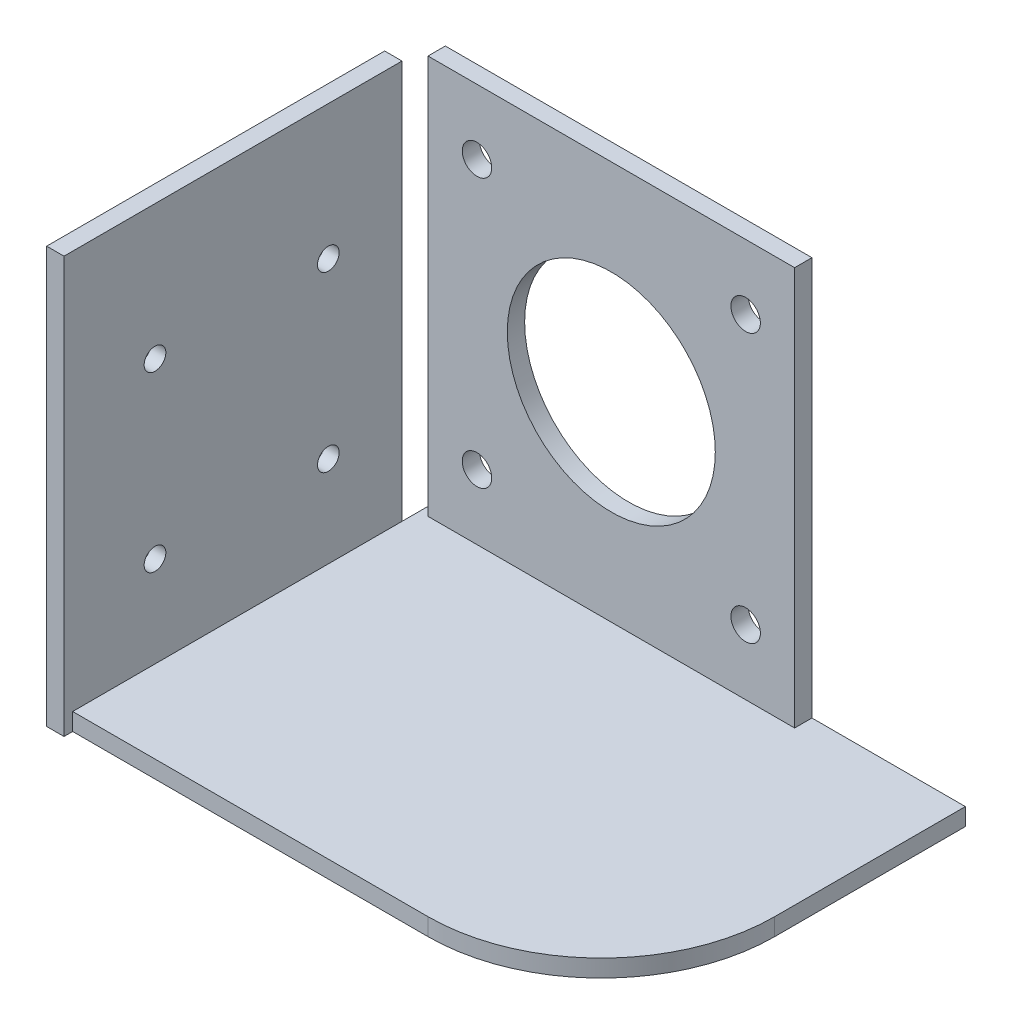
ISO-10303-21;
HEADER;
FILE_DESCRIPTION(('STEP AP214'),'2;1');
FILE_NAME('part.step','',(''),(''),'','','');
FILE_SCHEMA(('AUTOMOTIVE_DESIGN { 1 0 10303 214 1 1 1 1 }'));
ENDSEC;
DATA;
#1=APPLICATION_CONTEXT('core data for automotive mechanical design processes');
#2=APPLICATION_PROTOCOL_DEFINITION('international standard','automotive_design',2000,#1);
#3=PRODUCT_CONTEXT('',#1,'mechanical');
#4=PRODUCT('Part','Part','',(#3));
#5=PRODUCT_RELATED_PRODUCT_CATEGORY('part','',(#4));
#6=PRODUCT_DEFINITION_FORMATION('','',#4);
#7=PRODUCT_DEFINITION_CONTEXT('part definition',#1,'design');
#8=PRODUCT_DEFINITION('design','',#6,#7);
#9=PRODUCT_DEFINITION_SHAPE('','',#8);
#10=(LENGTH_UNIT() NAMED_UNIT(*) SI_UNIT(.MILLI.,.METRE.));
#11=(NAMED_UNIT(*) PLANE_ANGLE_UNIT() SI_UNIT($,.RADIAN.));
#12=(NAMED_UNIT(*) SI_UNIT($,.STERADIAN.) SOLID_ANGLE_UNIT());
#13=UNCERTAINTY_MEASURE_WITH_UNIT(LENGTH_MEASURE(1.E-05),#10,'distance_accuracy_value','');
#14=(GEOMETRIC_REPRESENTATION_CONTEXT(3) GLOBAL_UNCERTAINTY_ASSIGNED_CONTEXT((#13)) GLOBAL_UNIT_ASSIGNED_CONTEXT((#10,
#11,#12)) REPRESENTATION_CONTEXT('',''));
#15=CARTESIAN_POINT('',(0.,0.,0.));
#16=DIRECTION('',(0.,0.,1.));
#17=DIRECTION('',(1.,0.,0.));
#18=AXIS2_PLACEMENT_3D('',#15,#16,#17);
#19=CARTESIAN_POINT('',(0.,0.,2.));
#20=DIRECTION('',(0.,0.,-1.));
#21=DIRECTION('',(-1.,0.,0.));
#22=AXIS2_PLACEMENT_3D('',#19,#20,#21);
#23=PLANE('',#22);
#24=DIRECTION('',(0.,1.,0.));
#25=VECTOR('',#24,1.);
#26=CARTESIAN_POINT('',(21.15,-23.,2.));
#27=LINE('',#26,#25);
#28=CARTESIAN_POINT('',(21.15,-23.,2.));
#29=VERTEX_POINT('',#28);
#30=CARTESIAN_POINT('',(21.15,23.,2.));
#31=VERTEX_POINT('',#30);
#32=EDGE_CURVE('E249',#29,#31,#27,.T.);
#33=ORIENTED_EDGE('',*,*,#32,.T.);
#34=DIRECTION('',(-1.,0.,0.));
#35=VECTOR('',#34,1.);
#36=CARTESIAN_POINT('',(-21.15,23.,2.));
#37=LINE('',#36,#35);
#38=CARTESIAN_POINT('',(-21.15,23.,2.));
#39=VERTEX_POINT('',#38);
#40=EDGE_CURVE('E83',#31,#39,#37,.T.);
#41=ORIENTED_EDGE('',*,*,#40,.T.);
#42=DIRECTION('',(0.,-1.,0.));
#43=VECTOR('',#42,1.);
#44=CARTESIAN_POINT('',(-21.15,-23.,2.));
#45=LINE('',#44,#43);
#46=CARTESIAN_POINT('',(-21.15,-23.,2.));
#47=VERTEX_POINT('',#46);
#48=EDGE_CURVE('E253',#39,#47,#45,.T.);
#49=ORIENTED_EDGE('',*,*,#48,.T.);
#50=DIRECTION('',(1.,0.,0.));
#51=VECTOR('',#50,1.);
#52=CARTESIAN_POINT('',(-21.15,-23.,2.));
#53=LINE('',#52,#51);
#54=EDGE_CURVE('E58',#47,#29,#53,.T.);
#55=ORIENTED_EDGE('',*,*,#54,.T.);
#56=EDGE_LOOP('',(#33,#41,#49,#55));
#57=FACE_BOUND('',#56,.T.);
#58=CARTESIAN_POINT('',(0.,0.,2.));
#59=DIRECTION('',(0.,0.,1.));
#60=DIRECTION('',(1.,0.,0.));
#61=AXIS2_PLACEMENT_3D('',#58,#59,#60);
#62=CIRCLE('',#61,12.);
#63=CARTESIAN_POINT('',(12.,0.,2.));
#64=VERTEX_POINT('',#63);
#65=EDGE_CURVE('E243',#64,#64,#62,.T.);
#66=ORIENTED_EDGE('',*,*,#65,.F.);
#67=EDGE_LOOP('',(#66));
#68=FACE_BOUND('',#67,.T.);
#69=CARTESIAN_POINT('',(-15.5,15.5,2.));
#70=DIRECTION('',(0.,0.,1.));
#71=DIRECTION('',(1.,0.,0.));
#72=AXIS2_PLACEMENT_3D('',#69,#70,#71);
#73=CIRCLE('',#72,1.7);
#74=CARTESIAN_POINT('',(-13.8,15.5,2.));
#75=VERTEX_POINT('',#74);
#76=EDGE_CURVE('E237',#75,#75,#73,.T.);
#77=ORIENTED_EDGE('',*,*,#76,.F.);
#78=EDGE_LOOP('',(#77));
#79=FACE_BOUND('',#78,.T.);
#80=CARTESIAN_POINT('',(15.5,15.5000000000009,2.));
#81=DIRECTION('',(0.,0.,1.));
#82=DIRECTION('',(1.,0.,0.));
#83=AXIS2_PLACEMENT_3D('',#80,#81,#82);
#84=CIRCLE('',#83,1.7000000000009);
#85=CARTESIAN_POINT('',(17.2000000000009,15.5000000000009,2.));
#86=VERTEX_POINT('',#85);
#87=EDGE_CURVE('E231',#86,#86,#84,.T.);
#88=ORIENTED_EDGE('',*,*,#87,.F.);
#89=EDGE_LOOP('',(#88));
#90=FACE_BOUND('',#89,.T.);
#91=CARTESIAN_POINT('',(15.5000000000009,-15.4999999999991,2.));
#92=DIRECTION('',(0.,0.,1.));
#93=DIRECTION('',(1.,0.,0.));
#94=AXIS2_PLACEMENT_3D('',#91,#92,#93);
#95=CIRCLE('',#94,1.70000000000123);
#96=CARTESIAN_POINT('',(17.2000000000021,-15.4999999999991,2.));
#97=VERTEX_POINT('',#96);
#98=EDGE_CURVE('E225',#97,#97,#95,.T.);
#99=ORIENTED_EDGE('',*,*,#98,.F.);
#100=EDGE_LOOP('',(#99));
#101=FACE_BOUND('',#100,.T.);
#102=CARTESIAN_POINT('',(-15.4999999999991,-15.5,2.));
#103=DIRECTION('',(0.,0.,1.));
#104=DIRECTION('',(1.,0.,0.));
#105=AXIS2_PLACEMENT_3D('',#102,#103,#104);
#106=CIRCLE('',#105,1.70000000000047);
#107=CARTESIAN_POINT('',(-13.7999999999987,-15.5,2.));
#108=VERTEX_POINT('',#107);
#109=EDGE_CURVE('E219',#108,#108,#106,.T.);
#110=ORIENTED_EDGE('',*,*,#109,.F.);
#111=EDGE_LOOP('',(#110));
#112=FACE_BOUND('',#111,.T.);
#113=ADVANCED_FACE('F34',(#57,#68,#79,#90,#101,#112),#23,.F.);
#114=CARTESIAN_POINT('',(0.,0.,0.));
#115=DIRECTION('',(0.,0.,-1.));
#116=DIRECTION('',(-1.,0.,0.));
#117=AXIS2_PLACEMENT_3D('',#114,#115,#116);
#118=PLANE('',#117);
#119=CARTESIAN_POINT('',(15.5000000000009,-15.4999999999991,0.));
#120=DIRECTION('',(0.,0.,1.));
#121=DIRECTION('',(1.,0.,0.));
#122=AXIS2_PLACEMENT_3D('',#119,#120,#121);
#123=CIRCLE('',#122,1.70000000000123);
#124=CARTESIAN_POINT('',(17.2000000000021,-15.4999999999991,0.));
#125=VERTEX_POINT('',#124);
#126=EDGE_CURVE('E222',#125,#125,#123,.T.);
#127=ORIENTED_EDGE('',*,*,#126,.T.);
#128=EDGE_LOOP('',(#127));
#129=FACE_BOUND('',#128,.T.);
#130=CARTESIAN_POINT('',(-15.5,15.5,0.));
#131=DIRECTION('',(0.,0.,1.));
#132=DIRECTION('',(1.,0.,0.));
#133=AXIS2_PLACEMENT_3D('',#130,#131,#132);
#134=CIRCLE('',#133,1.7);
#135=CARTESIAN_POINT('',(-13.8,15.5,0.));
#136=VERTEX_POINT('',#135);
#137=EDGE_CURVE('E234',#136,#136,#134,.T.);
#138=ORIENTED_EDGE('',*,*,#137,.T.);
#139=EDGE_LOOP('',(#138));
#140=FACE_BOUND('',#139,.T.);
#141=DIRECTION('',(0.,1.,0.));
#142=VECTOR('',#141,1.);
#143=CARTESIAN_POINT('',(21.15,-23.,0.));
#144=LINE('',#143,#142);
#145=CARTESIAN_POINT('',(21.15,-23.,0.));
#146=VERTEX_POINT('',#145);
#147=CARTESIAN_POINT('',(21.15,23.,0.));
#148=VERTEX_POINT('',#147);
#149=EDGE_CURVE('E246',#146,#148,#144,.T.);
#150=ORIENTED_EDGE('',*,*,#149,.F.);
#151=DIRECTION('',(1.,0.,0.));
#152=VECTOR('',#151,1.);
#153=CARTESIAN_POINT('',(-21.15,-23.,0.));
#154=LINE('',#153,#152);
#155=CARTESIAN_POINT('',(38.85,-23.,0.));
#156=VERTEX_POINT('',#155);
#157=EDGE_CURVE('E178',#146,#156,#154,.T.);
#158=ORIENTED_EDGE('',*,*,#157,.T.);
#159=DIRECTION('',(0.,1.,0.));
#160=VECTOR('',#159,1.);
#161=CARTESIAN_POINT('',(38.85,-25.,0.));
#162=LINE('',#161,#160);
#163=CARTESIAN_POINT('',(38.85,-25.,0.));
#164=VERTEX_POINT('',#163);
#165=EDGE_CURVE('E215',#164,#156,#162,.T.);
#166=ORIENTED_EDGE('',*,*,#165,.F.);
#167=DIRECTION('',(1.,0.,0.));
#168=VECTOR('',#167,1.);
#169=CARTESIAN_POINT('',(-21.15,-25.,0.));
#170=LINE('',#169,#168);
#171=CARTESIAN_POINT('',(-22.15,-25.,0.));
#172=VERTEX_POINT('',#171);
#173=EDGE_CURVE('E179',#172,#164,#170,.T.);
#174=ORIENTED_EDGE('',*,*,#173,.F.);
#175=DIRECTION('',(0.,1.,0.));
#176=VECTOR('',#175,1.);
#177=CARTESIAN_POINT('',(-22.15,-25.,0.));
#178=LINE('',#177,#176);
#179=CARTESIAN_POINT('',(-22.15,-23.,0.));
#180=VERTEX_POINT('',#179);
#181=EDGE_CURVE('E191',#172,#180,#178,.T.);
#182=ORIENTED_EDGE('',*,*,#181,.T.);
#183=CARTESIAN_POINT('',(-21.15,-23.,0.));
#184=VERTEX_POINT('',#183);
#185=EDGE_CURVE('E192',#180,#184,#154,.T.);
#186=ORIENTED_EDGE('',*,*,#185,.T.);
#187=DIRECTION('',(0.,-1.,0.));
#188=VECTOR('',#187,1.);
#189=CARTESIAN_POINT('',(-21.15,-23.,0.));
#190=LINE('',#189,#188);
#191=CARTESIAN_POINT('',(-21.15,23.,0.));
#192=VERTEX_POINT('',#191);
#193=EDGE_CURVE('E251',#192,#184,#190,.T.);
#194=ORIENTED_EDGE('',*,*,#193,.F.);
#195=DIRECTION('',(-1.,0.,0.));
#196=VECTOR('',#195,1.);
#197=CARTESIAN_POINT('',(-21.15,23.,0.));
#198=LINE('',#197,#196);
#199=EDGE_CURVE('E257',#148,#192,#198,.T.);
#200=ORIENTED_EDGE('',*,*,#199,.F.);
#201=EDGE_LOOP('',(#150,#158,#166,#174,#182,#186,#194,#200));
#202=FACE_BOUND('',#201,.T.);
#203=CARTESIAN_POINT('',(0.,0.,0.));
#204=DIRECTION('',(0.,0.,1.));
#205=DIRECTION('',(1.,0.,0.));
#206=AXIS2_PLACEMENT_3D('',#203,#204,#205);
#207=CIRCLE('',#206,12.);
#208=CARTESIAN_POINT('',(12.,0.,0.));
#209=VERTEX_POINT('',#208);
#210=EDGE_CURVE('E240',#209,#209,#207,.T.);
#211=ORIENTED_EDGE('',*,*,#210,.T.);
#212=EDGE_LOOP('',(#211));
#213=FACE_BOUND('',#212,.T.);
#214=CARTESIAN_POINT('',(15.5,15.5000000000009,0.));
#215=DIRECTION('',(0.,0.,1.));
#216=DIRECTION('',(1.,0.,0.));
#217=AXIS2_PLACEMENT_3D('',#214,#215,#216);
#218=CIRCLE('',#217,1.7000000000009);
#219=CARTESIAN_POINT('',(17.2000000000009,15.5000000000009,0.));
#220=VERTEX_POINT('',#219);
#221=EDGE_CURVE('E228',#220,#220,#218,.T.);
#222=ORIENTED_EDGE('',*,*,#221,.T.);
#223=EDGE_LOOP('',(#222));
#224=FACE_BOUND('',#223,.T.);
#225=CARTESIAN_POINT('',(-15.4999999999991,-15.5,0.));
#226=DIRECTION('',(0.,0.,1.));
#227=DIRECTION('',(1.,0.,0.));
#228=AXIS2_PLACEMENT_3D('',#225,#226,#227);
#229=CIRCLE('',#228,1.70000000000047);
#230=CARTESIAN_POINT('',(-13.7999999999987,-15.5,0.));
#231=VERTEX_POINT('',#230);
#232=EDGE_CURVE('E218',#231,#231,#229,.T.);
#233=ORIENTED_EDGE('',*,*,#232,.T.);
#234=EDGE_LOOP('',(#233));
#235=FACE_BOUND('',#234,.T.);
#236=ADVANCED_FACE('F270',(#129,#140,#202,#213,#224,#235),#118,.T.);
#237=CARTESIAN_POINT('',(21.15,-23.,2.));
#238=DIRECTION('',(-1.,0.,0.));
#239=DIRECTION('',(0.,0.,1.));
#240=AXIS2_PLACEMENT_3D('',#237,#238,#239);
#241=PLANE('',#240);
#242=ORIENTED_EDGE('',*,*,#149,.T.);
#243=DIRECTION('',(0.,0.,-1.));
#244=VECTOR('',#243,1.);
#245=CARTESIAN_POINT('',(21.15,23.,2.));
#246=LINE('',#245,#244);
#247=EDGE_CURVE('E11',#31,#148,#246,.T.);
#248=ORIENTED_EDGE('',*,*,#247,.F.);
#249=ORIENTED_EDGE('',*,*,#32,.F.);
#250=DIRECTION('',(0.,0.,-1.));
#251=VECTOR('',#250,1.);
#252=CARTESIAN_POINT('',(21.15,-23.,2.));
#253=LINE('',#252,#251);
#254=EDGE_CURVE('E76',#29,#146,#253,.T.);
#255=ORIENTED_EDGE('',*,*,#254,.T.);
#256=EDGE_LOOP('',(#242,#248,#249,#255));
#257=FACE_BOUND('',#256,.T.);
#258=ADVANCED_FACE('F36',(#257),#241,.F.);
#259=CARTESIAN_POINT('',(-21.15,23.,2.));
#260=DIRECTION('',(0.,-1.,0.));
#261=DIRECTION('',(0.,0.,-1.));
#262=AXIS2_PLACEMENT_3D('',#259,#260,#261);
#263=PLANE('',#262);
#264=ORIENTED_EDGE('',*,*,#199,.T.);
#265=DIRECTION('',(0.,0.,-1.));
#266=VECTOR('',#265,1.);
#267=CARTESIAN_POINT('',(-21.15,23.,2.));
#268=LINE('',#267,#266);
#269=EDGE_CURVE('E42',#39,#192,#268,.T.);
#270=ORIENTED_EDGE('',*,*,#269,.F.);
#271=ORIENTED_EDGE('',*,*,#40,.F.);
#272=ORIENTED_EDGE('',*,*,#247,.T.);
#273=EDGE_LOOP('',(#264,#270,#271,#272));
#274=FACE_BOUND('',#273,.T.);
#275=ADVANCED_FACE('F316',(#274),#263,.F.);
#276=CARTESIAN_POINT('',(-21.15,-23.,2.));
#277=DIRECTION('',(1.,0.,0.));
#278=DIRECTION('',(0.,0.,-1.));
#279=AXIS2_PLACEMENT_3D('',#276,#277,#278);
#280=PLANE('',#279);
#281=ORIENTED_EDGE('',*,*,#193,.T.);
#282=DIRECTION('',(0.,0.,-1.));
#283=VECTOR('',#282,1.);
#284=CARTESIAN_POINT('',(-21.15,-23.,2.));
#285=LINE('',#284,#283);
#286=EDGE_CURVE('E261',#47,#184,#285,.T.);
#287=ORIENTED_EDGE('',*,*,#286,.F.);
#288=ORIENTED_EDGE('',*,*,#48,.F.);
#289=ORIENTED_EDGE('',*,*,#269,.T.);
#290=EDGE_LOOP('',(#281,#287,#288,#289));
#291=FACE_BOUND('',#290,.T.);
#292=ADVANCED_FACE('F267',(#291),#280,.F.);
#293=CARTESIAN_POINT('',(0.,0.,2.));
#294=DIRECTION('',(0.,0.,-1.));
#295=DIRECTION('',(-1.,0.,0.));
#296=AXIS2_PLACEMENT_3D('',#293,#294,#295);
#297=CYLINDRICAL_SURFACE('',#296,12.);
#298=ORIENTED_EDGE('',*,*,#65,.T.);
#299=EDGE_LOOP('',(#298));
#300=FACE_BOUND('',#299,.T.);
#301=ORIENTED_EDGE('',*,*,#210,.F.);
#302=EDGE_LOOP('',(#301));
#303=FACE_BOUND('',#302,.T.);
#304=ADVANCED_FACE('F312',(#300,#303),#297,.F.);
#305=CARTESIAN_POINT('',(-15.5,15.5,2.));
#306=DIRECTION('',(0.,0.,-1.));
#307=DIRECTION('',(-1.,0.,0.));
#308=AXIS2_PLACEMENT_3D('',#305,#306,#307);
#309=CYLINDRICAL_SURFACE('',#308,1.7);
#310=ORIENTED_EDGE('',*,*,#76,.T.);
#311=EDGE_LOOP('',(#310));
#312=FACE_BOUND('',#311,.T.);
#313=ORIENTED_EDGE('',*,*,#137,.F.);
#314=EDGE_LOOP('',(#313));
#315=FACE_BOUND('',#314,.T.);
#316=ADVANCED_FACE('F367',(#312,#315),#309,.F.);
#317=CARTESIAN_POINT('',(15.5,15.5000000000009,2.));
#318=DIRECTION('',(0.,0.,-1.));
#319=DIRECTION('',(-1.,0.,0.));
#320=AXIS2_PLACEMENT_3D('',#317,#318,#319);
#321=CYLINDRICAL_SURFACE('',#320,1.7000000000009);
#322=ORIENTED_EDGE('',*,*,#87,.T.);
#323=EDGE_LOOP('',(#322));
#324=FACE_BOUND('',#323,.T.);
#325=ORIENTED_EDGE('',*,*,#221,.F.);
#326=EDGE_LOOP('',(#325));
#327=FACE_BOUND('',#326,.T.);
#328=ADVANCED_FACE('F357',(#324,#327),#321,.F.);
#329=CARTESIAN_POINT('',(15.5000000000009,-15.4999999999991,2.));
#330=DIRECTION('',(0.,0.,-1.));
#331=DIRECTION('',(-1.,0.,0.));
#332=AXIS2_PLACEMENT_3D('',#329,#330,#331);
#333=CYLINDRICAL_SURFACE('',#332,1.70000000000123);
#334=ORIENTED_EDGE('',*,*,#98,.T.);
#335=EDGE_LOOP('',(#334));
#336=FACE_BOUND('',#335,.T.);
#337=ORIENTED_EDGE('',*,*,#126,.F.);
#338=EDGE_LOOP('',(#337));
#339=FACE_BOUND('',#338,.T.);
#340=ADVANCED_FACE('F346',(#336,#339),#333,.F.);
#341=CARTESIAN_POINT('',(-15.4999999999991,-15.5,2.));
#342=DIRECTION('',(0.,0.,-1.));
#343=DIRECTION('',(-1.,0.,0.));
#344=AXIS2_PLACEMENT_3D('',#341,#342,#343);
#345=CYLINDRICAL_SURFACE('',#344,1.70000000000047);
#346=ORIENTED_EDGE('',*,*,#109,.T.);
#347=EDGE_LOOP('',(#346));
#348=FACE_BOUND('',#347,.T.);
#349=ORIENTED_EDGE('',*,*,#232,.F.);
#350=EDGE_LOOP('',(#349));
#351=FACE_BOUND('',#350,.T.);
#352=ADVANCED_FACE('F341',(#348,#351),#345,.F.);
#353=CARTESIAN_POINT('',(38.85,-25.,0.));
#354=DIRECTION('',(-1.,0.,0.));
#355=DIRECTION('',(0.,0.,1.));
#356=AXIS2_PLACEMENT_3D('',#353,#354,#355);
#357=PLANE('',#356);
#358=DIRECTION('',(0.,0.,1.));
#359=VECTOR('',#358,1.);
#360=CARTESIAN_POINT('',(38.85,-23.,0.));
#361=LINE('',#360,#359);
#362=CARTESIAN_POINT('',(38.85,-23.,22.));
#363=VERTEX_POINT('',#362);
#364=EDGE_CURVE('E195',#156,#363,#361,.T.);
#365=ORIENTED_EDGE('',*,*,#364,.T.);
#366=DIRECTION('',(0.,1.,0.));
#367=VECTOR('',#366,1.);
#368=CARTESIAN_POINT('',(38.85,-25.,22.));
#369=LINE('',#368,#367);
#370=CARTESIAN_POINT('',(38.85,-25.,22.));
#371=VERTEX_POINT('',#370);
#372=EDGE_CURVE('E212',#371,#363,#369,.T.);
#373=ORIENTED_EDGE('',*,*,#372,.F.);
#374=DIRECTION('',(0.,0.,1.));
#375=VECTOR('',#374,1.);
#376=CARTESIAN_POINT('',(38.85,-25.,0.));
#377=LINE('',#376,#375);
#378=EDGE_CURVE('E181',#164,#371,#377,.T.);
#379=ORIENTED_EDGE('',*,*,#378,.F.);
#380=ORIENTED_EDGE('',*,*,#165,.T.);
#381=EDGE_LOOP('',(#365,#373,#379,#380));
#382=FACE_BOUND('',#381,.T.);
#383=ADVANCED_FACE('F285',(#382),#357,.F.);
#384=CARTESIAN_POINT('',(18.85,-25.,22.));
#385=DIRECTION('',(0.,1.,0.));
#386=DIRECTION('',(0.,0.,1.));
#387=AXIS2_PLACEMENT_3D('',#384,#385,#386);
#388=CYLINDRICAL_SURFACE('',#387,20.);
#389=CARTESIAN_POINT('',(18.85,-23.,22.));
#390=DIRECTION('',(0.,-1.,0.));
#391=DIRECTION('',(0.,0.,-1.));
#392=AXIS2_PLACEMENT_3D('',#389,#390,#391);
#393=CIRCLE('',#392,20.);
#394=CARTESIAN_POINT('',(18.85,-23.,42.));
#395=VERTEX_POINT('',#394);
#396=EDGE_CURVE('E197',#363,#395,#393,.T.);
#397=ORIENTED_EDGE('',*,*,#396,.T.);
#398=DIRECTION('',(0.,1.,0.));
#399=VECTOR('',#398,1.);
#400=CARTESIAN_POINT('',(18.85,-25.,42.));
#401=LINE('',#400,#399);
#402=CARTESIAN_POINT('',(18.85,-25.,42.));
#403=VERTEX_POINT('',#402);
#404=EDGE_CURVE('E209',#403,#395,#401,.T.);
#405=ORIENTED_EDGE('',*,*,#404,.F.);
#406=CARTESIAN_POINT('',(18.85,-25.,22.));
#407=DIRECTION('',(0.,-1.,0.));
#408=DIRECTION('',(0.,0.,-1.));
#409=AXIS2_PLACEMENT_3D('',#406,#407,#408);
#410=CIRCLE('',#409,20.);
#411=EDGE_CURVE('E184',#371,#403,#410,.T.);
#412=ORIENTED_EDGE('',*,*,#411,.F.);
#413=ORIENTED_EDGE('',*,*,#372,.T.);
#414=EDGE_LOOP('',(#397,#405,#412,#413));
#415=FACE_BOUND('',#414,.T.);
#416=ADVANCED_FACE('F299',(#415),#388,.T.);
#417=CARTESIAN_POINT('',(-21.15,-25.,42.));
#418=DIRECTION('',(0.,0.,-1.));
#419=DIRECTION('',(-1.,0.,0.));
#420=AXIS2_PLACEMENT_3D('',#417,#418,#419);
#421=PLANE('',#420);
#422=DIRECTION('',(-1.,0.,0.));
#423=VECTOR('',#422,1.);
#424=CARTESIAN_POINT('',(-21.15,-23.,42.));
#425=LINE('',#424,#423);
#426=CARTESIAN_POINT('',(-22.15,-23.,42.));
#427=VERTEX_POINT('',#426);
#428=EDGE_CURVE('E200',#395,#427,#425,.T.);
#429=ORIENTED_EDGE('',*,*,#428,.T.);
#430=DIRECTION('',(0.,1.,0.));
#431=VECTOR('',#430,1.);
#432=CARTESIAN_POINT('',(-22.15,-25.,42.));
#433=LINE('',#432,#431);
#434=CARTESIAN_POINT('',(-22.15,-25.,42.));
#435=VERTEX_POINT('',#434);
#436=EDGE_CURVE('E207',#435,#427,#433,.T.);
#437=ORIENTED_EDGE('',*,*,#436,.F.);
#438=DIRECTION('',(-1.,0.,0.));
#439=VECTOR('',#438,1.);
#440=CARTESIAN_POINT('',(-21.15,-25.,42.));
#441=LINE('',#440,#439);
#442=EDGE_CURVE('E186',#403,#435,#441,.T.);
#443=ORIENTED_EDGE('',*,*,#442,.F.);
#444=ORIENTED_EDGE('',*,*,#404,.T.);
#445=EDGE_LOOP('',(#429,#437,#443,#444));
#446=FACE_BOUND('',#445,.T.);
#447=ADVANCED_FACE('F292',(#446),#421,.F.);
#448=CARTESIAN_POINT('',(-22.15,-25.,0.));
#449=DIRECTION('',(1.,0.,0.));
#450=DIRECTION('',(0.,0.,-1.));
#451=AXIS2_PLACEMENT_3D('',#448,#449,#450);
#452=PLANE('',#451);
#453=DIRECTION('',(0.,0.,-1.));
#454=VECTOR('',#453,1.);
#455=CARTESIAN_POINT('',(-22.15,-25.,0.));
#456=LINE('',#455,#454);
#457=CARTESIAN_POINT('',(-22.15,-25.,4.));
#458=VERTEX_POINT('',#457);
#459=EDGE_CURVE('E189',#458,#172,#456,.T.);
#460=ORIENTED_EDGE('',*,*,#459,.F.);
#461=DIRECTION('',(0.,1.,0.));
#462=VECTOR('',#461,1.);
#463=CARTESIAN_POINT('',(-22.15,-64.0512483795333,4.));
#464=LINE('',#463,#462);
#465=CARTESIAN_POINT('',(-22.15,-23.,3.99999999999999));
#466=VERTEX_POINT('',#465);
#467=EDGE_CURVE('E161',#458,#466,#464,.T.);
#468=ORIENTED_EDGE('',*,*,#467,.T.);
#469=DIRECTION('',(0.,0.,-1.));
#470=VECTOR('',#469,1.);
#471=CARTESIAN_POINT('',(-22.15,-23.,0.));
#472=LINE('',#471,#470);
#473=EDGE_CURVE('E203',#466,#180,#472,.T.);
#474=ORIENTED_EDGE('',*,*,#473,.T.);
#475=ORIENTED_EDGE('',*,*,#181,.F.);
#476=EDGE_LOOP('',(#460,#468,#474,#475));
#477=FACE_BOUND('',#476,.T.);
#478=ADVANCED_FACE('F290',(#477),#452,.F.);
#479=CARTESIAN_POINT('',(18.85,-25.,22.));
#480=DIRECTION('',(0.,-1.,0.));
#481=DIRECTION('',(0.,0.,-1.));
#482=AXIS2_PLACEMENT_3D('',#479,#480,#481);
#483=PLANE('',#482);
#484=ORIENTED_EDGE('',*,*,#173,.T.);
#485=ORIENTED_EDGE('',*,*,#378,.T.);
#486=ORIENTED_EDGE('',*,*,#411,.T.);
#487=ORIENTED_EDGE('',*,*,#442,.T.);
#488=DIRECTION('',(0.,0.,-1.));
#489=VECTOR('',#488,1.);
#490=CARTESIAN_POINT('',(-22.15,-25.,4.));
#491=LINE('',#490,#489);
#492=CARTESIAN_POINT('',(-22.15,-25.,43.));
#493=VERTEX_POINT('',#492);
#494=EDGE_CURVE('E171',#493,#435,#491,.T.);
#495=ORIENTED_EDGE('',*,*,#494,.F.);
#496=DIRECTION('',(1.,0.,0.));
#497=VECTOR('',#496,1.);
#498=CARTESIAN_POINT('',(-22.15,-25.,43.));
#499=LINE('',#498,#497);
#500=CARTESIAN_POINT('',(-24.15,-25.,43.));
#501=VERTEX_POINT('',#500);
#502=EDGE_CURVE('E147',#501,#493,#499,.T.);
#503=ORIENTED_EDGE('',*,*,#502,.F.);
#504=DIRECTION('',(0.,0.,1.));
#505=VECTOR('',#504,1.);
#506=CARTESIAN_POINT('',(-24.15,-25.,4.));
#507=LINE('',#506,#505);
#508=CARTESIAN_POINT('',(-24.15,-25.,4.));
#509=VERTEX_POINT('',#508);
#510=EDGE_CURVE('E141',#509,#501,#507,.T.);
#511=ORIENTED_EDGE('',*,*,#510,.F.);
#512=DIRECTION('',(-1.,0.,0.));
#513=VECTOR('',#512,1.);
#514=CARTESIAN_POINT('',(-22.15,-25.,4.));
#515=LINE('',#514,#513);
#516=EDGE_CURVE('E145',#458,#509,#515,.T.);
#517=ORIENTED_EDGE('',*,*,#516,.F.);
#518=ORIENTED_EDGE('',*,*,#459,.T.);
#519=EDGE_LOOP('',(#484,#485,#486,#487,#495,#503,#511,#517,#518));
#520=FACE_BOUND('',#519,.T.);
#521=ADVANCED_FACE('F143',(#520),#483,.T.);
#522=CARTESIAN_POINT('',(18.85,-23.,22.));
#523=DIRECTION('',(0.,-1.,0.));
#524=DIRECTION('',(0.,0.,-1.));
#525=AXIS2_PLACEMENT_3D('',#522,#523,#524);
#526=PLANE('',#525);
#527=ORIENTED_EDGE('',*,*,#254,.F.);
#528=ORIENTED_EDGE('',*,*,#54,.F.);
#529=ORIENTED_EDGE('',*,*,#286,.T.);
#530=ORIENTED_EDGE('',*,*,#185,.F.);
#531=ORIENTED_EDGE('',*,*,#473,.F.);
#532=EDGE_CURVE('E182',#427,#466,#472,.T.);
#533=ORIENTED_EDGE('',*,*,#532,.F.);
#534=ORIENTED_EDGE('',*,*,#428,.F.);
#535=ORIENTED_EDGE('',*,*,#396,.F.);
#536=ORIENTED_EDGE('',*,*,#364,.F.);
#537=ORIENTED_EDGE('',*,*,#157,.F.);
#538=EDGE_LOOP('',(#527,#528,#529,#530,#531,#533,#534,#535,#536,#537));
#539=FACE_BOUND('',#538,.T.);
#540=ADVANCED_FACE('F277',(#539),#526,.F.);
#541=CARTESIAN_POINT('',(0.,23.,0.));
#542=DIRECTION('',(0.,-1.,0.));
#543=DIRECTION('',(0.,0.,-1.));
#544=AXIS2_PLACEMENT_3D('',#541,#542,#543);
#545=PLANE('',#544);
#546=DIRECTION('',(0.,0.,-1.));
#547=VECTOR('',#546,1.);
#548=CARTESIAN_POINT('',(-22.15,23.,4.));
#549=LINE('',#548,#547);
#550=CARTESIAN_POINT('',(-22.15,23.,43.));
#551=VERTEX_POINT('',#550);
#552=CARTESIAN_POINT('',(-22.15,23.,4.));
#553=VERTEX_POINT('',#552);
#554=EDGE_CURVE('E169',#551,#553,#549,.T.);
#555=ORIENTED_EDGE('',*,*,#554,.T.);
#556=DIRECTION('',(-1.,0.,0.));
#557=VECTOR('',#556,1.);
#558=CARTESIAN_POINT('',(-22.15,23.,4.));
#559=LINE('',#558,#557);
#560=CARTESIAN_POINT('',(-24.15,23.,4.));
#561=VERTEX_POINT('',#560);
#562=EDGE_CURVE('E612',#553,#561,#559,.T.);
#563=ORIENTED_EDGE('',*,*,#562,.T.);
#564=DIRECTION('',(0.,0.,1.));
#565=VECTOR('',#564,1.);
#566=CARTESIAN_POINT('',(-24.15,23.,4.));
#567=LINE('',#566,#565);
#568=CARTESIAN_POINT('',(-24.15,23.,43.));
#569=VERTEX_POINT('',#568);
#570=EDGE_CURVE('E156',#561,#569,#567,.T.);
#571=ORIENTED_EDGE('',*,*,#570,.T.);
#572=DIRECTION('',(1.,0.,0.));
#573=VECTOR('',#572,1.);
#574=CARTESIAN_POINT('',(-22.15,23.,43.));
#575=LINE('',#574,#573);
#576=EDGE_CURVE('E163',#569,#551,#575,.T.);
#577=ORIENTED_EDGE('',*,*,#576,.T.);
#578=EDGE_LOOP('',(#555,#563,#571,#577));
#579=FACE_BOUND('',#578,.T.);
#580=ADVANCED_FACE('F438',(#579),#545,.F.);
#581=CARTESIAN_POINT('',(-22.15,-64.0512483795333,4.));
#582=DIRECTION('',(0.,0.,-1.));
#583=DIRECTION('',(-1.,0.,0.));
#584=AXIS2_PLACEMENT_3D('',#581,#582,#583);
#585=PLANE('',#584);
#586=ORIENTED_EDGE('',*,*,#467,.F.);
#587=ORIENTED_EDGE('',*,*,#516,.T.);
#588=DIRECTION('',(0.,1.,0.));
#589=VECTOR('',#588,1.);
#590=CARTESIAN_POINT('',(-24.15,-64.0512483795333,4.));
#591=LINE('',#590,#589);
#592=EDGE_CURVE('E151',#509,#561,#591,.T.);
#593=ORIENTED_EDGE('',*,*,#592,.T.);
#594=ORIENTED_EDGE('',*,*,#562,.F.);
#595=EDGE_CURVE('E49',#466,#553,#464,.T.);
#596=ORIENTED_EDGE('',*,*,#595,.F.);
#597=EDGE_LOOP('',(#586,#587,#593,#594,#596));
#598=FACE_BOUND('',#597,.T.);
#599=ADVANCED_FACE('F159',(#598),#585,.T.);
#600=CARTESIAN_POINT('',(-24.15,-64.0512483795333,4.));
#601=DIRECTION('',(-1.,0.,0.));
#602=DIRECTION('',(0.,0.,1.));
#603=AXIS2_PLACEMENT_3D('',#600,#601,#602);
#604=PLANE('',#603);
#605=CARTESIAN_POINT('',(-24.15,7.5,12.5));
#606=DIRECTION('',(-1.,0.,0.));
#607=DIRECTION('',(0.,0.,1.));
#608=AXIS2_PLACEMENT_3D('',#605,#606,#607);
#609=CIRCLE('',#608,1.525);
#610=CARTESIAN_POINT('',(-24.15,7.5,14.025));
#611=VERTEX_POINT('',#610);
#612=EDGE_CURVE('E578',#611,#611,#609,.T.);
#613=ORIENTED_EDGE('',*,*,#612,.F.);
#614=EDGE_LOOP('',(#613));
#615=FACE_BOUND('',#614,.T.);
#616=CARTESIAN_POINT('',(-24.15,7.5,32.5));
#617=DIRECTION('',(-1.,0.,0.));
#618=DIRECTION('',(0.,0.,1.));
#619=AXIS2_PLACEMENT_3D('',#616,#617,#618);
#620=CIRCLE('',#619,1.525);
#621=CARTESIAN_POINT('',(-24.15,7.5,34.025));
#622=VERTEX_POINT('',#621);
#623=EDGE_CURVE('E585',#622,#622,#620,.T.);
#624=ORIENTED_EDGE('',*,*,#623,.F.);
#625=EDGE_LOOP('',(#624));
#626=FACE_BOUND('',#625,.T.);
#627=CARTESIAN_POINT('',(-24.15,-12.5,32.5));
#628=DIRECTION('',(-1.,0.,0.));
#629=DIRECTION('',(0.,0.,1.));
#630=AXIS2_PLACEMENT_3D('',#627,#628,#629);
#631=CIRCLE('',#630,1.525);
#632=CARTESIAN_POINT('',(-24.15,-12.5,34.025));
#633=VERTEX_POINT('',#632);
#634=EDGE_CURVE('E594',#633,#633,#631,.T.);
#635=ORIENTED_EDGE('',*,*,#634,.F.);
#636=EDGE_LOOP('',(#635));
#637=FACE_BOUND('',#636,.T.);
#638=CARTESIAN_POINT('',(-24.15,-12.5,12.5));
#639=DIRECTION('',(-1.,0.,0.));
#640=DIRECTION('',(0.,0.,1.));
#641=AXIS2_PLACEMENT_3D('',#638,#639,#640);
#642=CIRCLE('',#641,1.525);
#643=CARTESIAN_POINT('',(-24.15,-12.5,14.025));
#644=VERTEX_POINT('',#643);
#645=EDGE_CURVE('E603',#644,#644,#642,.T.);
#646=ORIENTED_EDGE('',*,*,#645,.F.);
#647=EDGE_LOOP('',(#646));
#648=FACE_BOUND('',#647,.T.);
#649=ORIENTED_EDGE('',*,*,#592,.F.);
#650=ORIENTED_EDGE('',*,*,#510,.T.);
#651=DIRECTION('',(0.,1.,0.));
#652=VECTOR('',#651,1.);
#653=CARTESIAN_POINT('',(-24.15,-64.0512483795333,43.));
#654=LINE('',#653,#652);
#655=EDGE_CURVE('E150',#501,#569,#654,.T.);
#656=ORIENTED_EDGE('',*,*,#655,.T.);
#657=ORIENTED_EDGE('',*,*,#570,.F.);
#658=EDGE_LOOP('',(#649,#650,#656,#657));
#659=FACE_BOUND('',#658,.T.);
#660=ADVANCED_FACE('F154',(#615,#626,#637,#648,#659),#604,.T.);
#661=CARTESIAN_POINT('',(-22.15,-64.0512483795333,43.));
#662=DIRECTION('',(0.,0.,1.));
#663=DIRECTION('',(1.,0.,0.));
#664=AXIS2_PLACEMENT_3D('',#661,#662,#663);
#665=PLANE('',#664);
#666=ORIENTED_EDGE('',*,*,#655,.F.);
#667=ORIENTED_EDGE('',*,*,#502,.T.);
#668=DIRECTION('',(0.,1.,0.));
#669=VECTOR('',#668,1.);
#670=CARTESIAN_POINT('',(-22.15,-64.0512483795333,43.));
#671=LINE('',#670,#669);
#672=EDGE_CURVE('E173',#493,#551,#671,.T.);
#673=ORIENTED_EDGE('',*,*,#672,.T.);
#674=ORIENTED_EDGE('',*,*,#576,.F.);
#675=EDGE_LOOP('',(#666,#667,#673,#674));
#676=FACE_BOUND('',#675,.T.);
#677=ADVANCED_FACE('F460',(#676),#665,.T.);
#678=CARTESIAN_POINT('',(-22.15,-64.0512483795333,4.));
#679=DIRECTION('',(1.,0.,0.));
#680=DIRECTION('',(0.,0.,-1.));
#681=AXIS2_PLACEMENT_3D('',#678,#679,#680);
#682=PLANE('',#681);
#683=CARTESIAN_POINT('',(-22.15,7.5,12.5));
#684=DIRECTION('',(1.,0.,0.));
#685=DIRECTION('',(0.,0.,-1.));
#686=AXIS2_PLACEMENT_3D('',#683,#684,#685);
#687=CIRCLE('',#686,1.25);
#688=CARTESIAN_POINT('',(-22.15,7.5,11.25));
#689=VERTEX_POINT('',#688);
#690=EDGE_CURVE('E580',#689,#689,#687,.T.);
#691=ORIENTED_EDGE('',*,*,#690,.F.);
#692=EDGE_LOOP('',(#691));
#693=FACE_BOUND('',#692,.T.);
#694=CARTESIAN_POINT('',(-22.15,7.5,32.5));
#695=DIRECTION('',(1.,0.,0.));
#696=DIRECTION('',(0.,0.,-1.));
#697=AXIS2_PLACEMENT_3D('',#694,#695,#696);
#698=CIRCLE('',#697,1.25);
#699=CARTESIAN_POINT('',(-22.15,7.5,31.25));
#700=VERTEX_POINT('',#699);
#701=EDGE_CURVE('E591',#700,#700,#698,.T.);
#702=ORIENTED_EDGE('',*,*,#701,.F.);
#703=EDGE_LOOP('',(#702));
#704=FACE_BOUND('',#703,.T.);
#705=CARTESIAN_POINT('',(-22.15,-12.5,32.5));
#706=DIRECTION('',(1.,0.,0.));
#707=DIRECTION('',(0.,0.,-1.));
#708=AXIS2_PLACEMENT_3D('',#705,#706,#707);
#709=CIRCLE('',#708,1.25);
#710=CARTESIAN_POINT('',(-22.15,-12.5,31.25));
#711=VERTEX_POINT('',#710);
#712=EDGE_CURVE('E600',#711,#711,#709,.T.);
#713=ORIENTED_EDGE('',*,*,#712,.F.);
#714=EDGE_LOOP('',(#713));
#715=FACE_BOUND('',#714,.T.);
#716=CARTESIAN_POINT('',(-22.15,-12.5,12.5));
#717=DIRECTION('',(1.,0.,0.));
#718=DIRECTION('',(0.,0.,-1.));
#719=AXIS2_PLACEMENT_3D('',#716,#717,#718);
#720=CIRCLE('',#719,1.25);
#721=CARTESIAN_POINT('',(-22.15,-12.5,11.25));
#722=VERTEX_POINT('',#721);
#723=EDGE_CURVE('E609',#722,#722,#720,.T.);
#724=ORIENTED_EDGE('',*,*,#723,.F.);
#725=EDGE_LOOP('',(#724));
#726=FACE_BOUND('',#725,.T.);
#727=ORIENTED_EDGE('',*,*,#436,.T.);
#728=ORIENTED_EDGE('',*,*,#532,.T.);
#729=ORIENTED_EDGE('',*,*,#595,.T.);
#730=ORIENTED_EDGE('',*,*,#554,.F.);
#731=ORIENTED_EDGE('',*,*,#672,.F.);
#732=ORIENTED_EDGE('',*,*,#494,.T.);
#733=EDGE_LOOP('',(#727,#728,#729,#730,#731,#732));
#734=FACE_BOUND('',#733,.T.);
#735=ADVANCED_FACE('F465',(#693,#704,#715,#726,#734),#682,.T.);
#736=CARTESIAN_POINT('',(-24.15,-12.5,12.5));
#737=DIRECTION('',(-1.,0.,0.));
#738=DIRECTION('',(0.,0.,1.));
#739=AXIS2_PLACEMENT_3D('',#736,#737,#738);
#740=CYLINDRICAL_SURFACE('',#739,1.25);
#741=CARTESIAN_POINT('',(-23.875,-12.5,12.5));
#742=DIRECTION('',(-1.,0.,0.));
#743=DIRECTION('',(0.,0.,1.));
#744=AXIS2_PLACEMENT_3D('',#741,#742,#743);
#745=CIRCLE('',#744,1.25);
#746=CARTESIAN_POINT('',(-23.875,-12.5,13.75));
#747=VERTEX_POINT('',#746);
#748=EDGE_CURVE('E606',#747,#747,#745,.T.);
#749=ORIENTED_EDGE('',*,*,#748,.T.);
#750=EDGE_LOOP('',(#749));
#751=FACE_BOUND('',#750,.T.);
#752=ORIENTED_EDGE('',*,*,#723,.T.);
#753=EDGE_LOOP('',(#752));
#754=FACE_BOUND('',#753,.T.);
#755=ADVANCED_FACE('F482',(#751,#754),#740,.F.);
#756=CARTESIAN_POINT('',(-24.15,-12.5,12.5));
#757=DIRECTION('',(-1.,0.,0.));
#758=DIRECTION('',(0.,0.,1.));
#759=AXIS2_PLACEMENT_3D('',#756,#757,#758);
#760=CONICAL_SURFACE('',#759,1.525,0.785398163397448);
#761=ORIENTED_EDGE('',*,*,#748,.F.);
#762=EDGE_LOOP('',(#761));
#763=FACE_BOUND('',#762,.T.);
#764=ORIENTED_EDGE('',*,*,#645,.T.);
#765=EDGE_LOOP('',(#764));
#766=FACE_BOUND('',#765,.T.);
#767=ADVANCED_FACE('F493',(#763,#766),#760,.F.);
#768=CARTESIAN_POINT('',(-24.15,-12.5,32.5));
#769=DIRECTION('',(-1.,0.,0.));
#770=DIRECTION('',(0.,0.,1.));
#771=AXIS2_PLACEMENT_3D('',#768,#769,#770);
#772=CYLINDRICAL_SURFACE('',#771,1.25);
#773=CARTESIAN_POINT('',(-23.875,-12.5,32.5));
#774=DIRECTION('',(-1.,0.,0.));
#775=DIRECTION('',(0.,0.,1.));
#776=AXIS2_PLACEMENT_3D('',#773,#774,#775);
#777=CIRCLE('',#776,1.25);
#778=CARTESIAN_POINT('',(-23.875,-12.5,33.75));
#779=VERTEX_POINT('',#778);
#780=EDGE_CURVE('E597',#779,#779,#777,.T.);
#781=ORIENTED_EDGE('',*,*,#780,.T.);
#782=EDGE_LOOP('',(#781));
#783=FACE_BOUND('',#782,.T.);
#784=ORIENTED_EDGE('',*,*,#712,.T.);
#785=EDGE_LOOP('',(#784));
#786=FACE_BOUND('',#785,.T.);
#787=ADVANCED_FACE('F504',(#783,#786),#772,.F.);
#788=CARTESIAN_POINT('',(-24.15,-12.5,32.5));
#789=DIRECTION('',(-1.,0.,0.));
#790=DIRECTION('',(0.,0.,1.));
#791=AXIS2_PLACEMENT_3D('',#788,#789,#790);
#792=CONICAL_SURFACE('',#791,1.525,0.785398163397442);
#793=ORIENTED_EDGE('',*,*,#780,.F.);
#794=EDGE_LOOP('',(#793));
#795=FACE_BOUND('',#794,.T.);
#796=ORIENTED_EDGE('',*,*,#634,.T.);
#797=EDGE_LOOP('',(#796));
#798=FACE_BOUND('',#797,.T.);
#799=ADVANCED_FACE('F514',(#795,#798),#792,.F.);
#800=CARTESIAN_POINT('',(-24.15,7.5,32.5));
#801=DIRECTION('',(-1.,0.,0.));
#802=DIRECTION('',(0.,0.,1.));
#803=AXIS2_PLACEMENT_3D('',#800,#801,#802);
#804=CYLINDRICAL_SURFACE('',#803,1.25);
#805=CARTESIAN_POINT('',(-23.875,7.5,32.5));
#806=DIRECTION('',(-1.,0.,0.));
#807=DIRECTION('',(0.,0.,1.));
#808=AXIS2_PLACEMENT_3D('',#805,#806,#807);
#809=CIRCLE('',#808,1.25);
#810=CARTESIAN_POINT('',(-23.875,7.5,33.75));
#811=VERTEX_POINT('',#810);
#812=EDGE_CURVE('E588',#811,#811,#809,.T.);
#813=ORIENTED_EDGE('',*,*,#812,.T.);
#814=EDGE_LOOP('',(#813));
#815=FACE_BOUND('',#814,.T.);
#816=ORIENTED_EDGE('',*,*,#701,.T.);
#817=EDGE_LOOP('',(#816));
#818=FACE_BOUND('',#817,.T.);
#819=ADVANCED_FACE('F525',(#815,#818),#804,.F.);
#820=CARTESIAN_POINT('',(-24.15,7.5,32.5));
#821=DIRECTION('',(-1.,0.,0.));
#822=DIRECTION('',(0.,0.,1.));
#823=AXIS2_PLACEMENT_3D('',#820,#821,#822);
#824=CONICAL_SURFACE('',#823,1.525,0.785398163397442);
#825=ORIENTED_EDGE('',*,*,#812,.F.);
#826=EDGE_LOOP('',(#825));
#827=FACE_BOUND('',#826,.T.);
#828=ORIENTED_EDGE('',*,*,#623,.T.);
#829=EDGE_LOOP('',(#828));
#830=FACE_BOUND('',#829,.T.);
#831=ADVANCED_FACE('F535',(#827,#830),#824,.F.);
#832=CARTESIAN_POINT('',(-24.15,7.5,12.5));
#833=DIRECTION('',(-1.,0.,0.));
#834=DIRECTION('',(0.,0.,1.));
#835=AXIS2_PLACEMENT_3D('',#832,#833,#834);
#836=CYLINDRICAL_SURFACE('',#835,1.25);
#837=CARTESIAN_POINT('',(-23.875,7.5,12.5));
#838=DIRECTION('',(-1.,0.,0.));
#839=DIRECTION('',(0.,0.,1.));
#840=AXIS2_PLACEMENT_3D('',#837,#838,#839);
#841=CIRCLE('',#840,1.25);
#842=CARTESIAN_POINT('',(-23.875,7.5,13.75));
#843=VERTEX_POINT('',#842);
#844=EDGE_CURVE('E575',#843,#843,#841,.T.);
#845=ORIENTED_EDGE('',*,*,#844,.T.);
#846=EDGE_LOOP('',(#845));
#847=FACE_BOUND('',#846,.T.);
#848=ORIENTED_EDGE('',*,*,#690,.T.);
#849=EDGE_LOOP('',(#848));
#850=FACE_BOUND('',#849,.T.);
#851=ADVANCED_FACE('F546',(#847,#850),#836,.F.);
#852=CARTESIAN_POINT('',(-24.15,7.5,12.5));
#853=DIRECTION('',(-1.,0.,0.));
#854=DIRECTION('',(0.,0.,1.));
#855=AXIS2_PLACEMENT_3D('',#852,#853,#854);
#856=CONICAL_SURFACE('',#855,1.525,0.785398163397445);
#857=ORIENTED_EDGE('',*,*,#844,.F.);
#858=EDGE_LOOP('',(#857));
#859=FACE_BOUND('',#858,.T.);
#860=ORIENTED_EDGE('',*,*,#612,.T.);
#861=EDGE_LOOP('',(#860));
#862=FACE_BOUND('',#861,.T.);
#863=ADVANCED_FACE('F556',(#859,#862),#856,.F.);
#864=CLOSED_SHELL('',(#113,#236,#258,#275,#292,#304,#316,#328,#340,#352,#383,#416,#447,#478,
#521,#540,#580,#599,#660,#677,#735,#755,#767,#787,#799,#819,#831,#851,#863));
#865=MANIFOLD_SOLID_BREP('B2',#864);
#866=ADVANCED_BREP_SHAPE_REPRESENTATION('',(#18,#865),#14);
#867=SHAPE_DEFINITION_REPRESENTATION(#9,#866);
ENDSEC;
END-ISO-10303-21;
